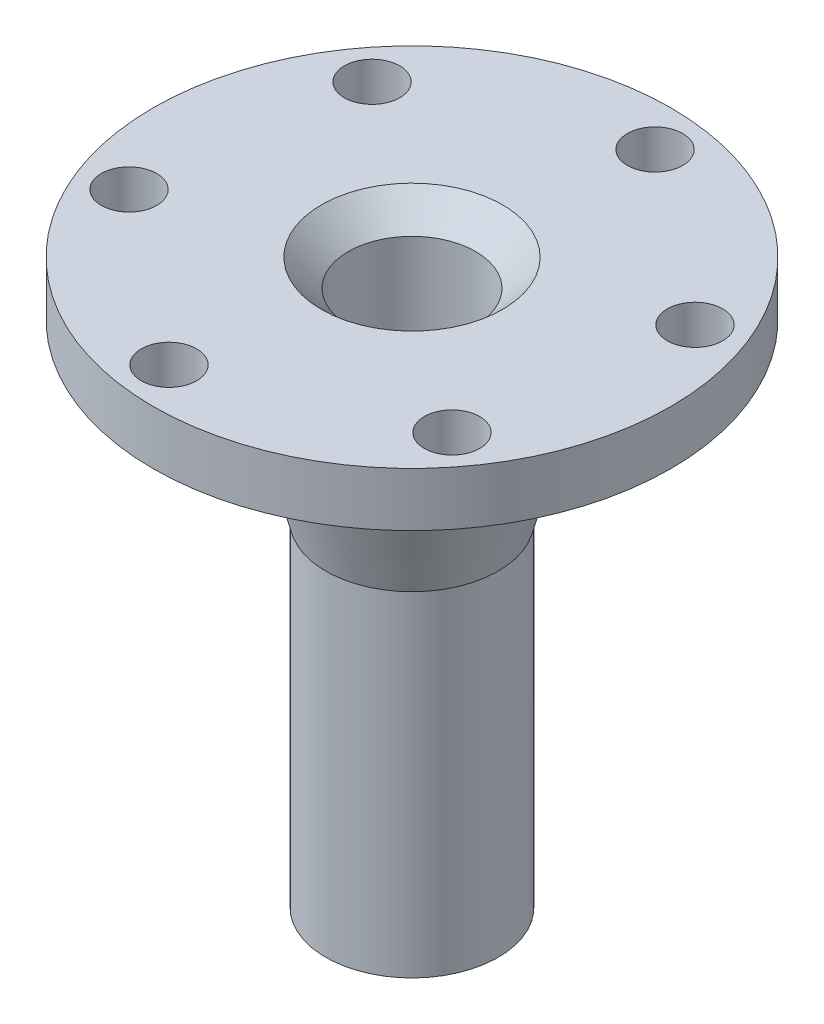
ISO-10303-21;
HEADER;
FILE_DESCRIPTION(('STEP AP214'),'2;1');
FILE_NAME('part.step','',(''),(''),'','','');
FILE_SCHEMA(('AUTOMOTIVE_DESIGN { 1 0 10303 214 1 1 1 1 }'));
ENDSEC;
DATA;
#1=APPLICATION_CONTEXT('core data for automotive mechanical design processes');
#2=APPLICATION_PROTOCOL_DEFINITION('international standard','automotive_design',2000,#1);
#3=PRODUCT_CONTEXT('',#1,'mechanical');
#4=PRODUCT('Part','Part','',(#3));
#5=PRODUCT_RELATED_PRODUCT_CATEGORY('part','',(#4));
#6=PRODUCT_DEFINITION_FORMATION('','',#4);
#7=PRODUCT_DEFINITION_CONTEXT('part definition',#1,'design');
#8=PRODUCT_DEFINITION('design','',#6,#7);
#9=PRODUCT_DEFINITION_SHAPE('','',#8);
#10=(LENGTH_UNIT() NAMED_UNIT(*) SI_UNIT(.MILLI.,.METRE.));
#11=(NAMED_UNIT(*) PLANE_ANGLE_UNIT() SI_UNIT($,.RADIAN.));
#12=(NAMED_UNIT(*) SI_UNIT($,.STERADIAN.) SOLID_ANGLE_UNIT());
#13=UNCERTAINTY_MEASURE_WITH_UNIT(LENGTH_MEASURE(1.E-05),#10,'distance_accuracy_value','');
#14=(GEOMETRIC_REPRESENTATION_CONTEXT(3) GLOBAL_UNCERTAINTY_ASSIGNED_CONTEXT((#13)) GLOBAL_UNIT_ASSIGNED_CONTEXT((#10,
#11,#12)) REPRESENTATION_CONTEXT('',''));
#15=CARTESIAN_POINT('',(0.,0.,0.));
#16=DIRECTION('',(0.,0.,1.));
#17=DIRECTION('',(1.,0.,0.));
#18=AXIS2_PLACEMENT_3D('',#15,#16,#17);
#19=CARTESIAN_POINT('',(0.,30.,0.));
#20=DIRECTION('',(0.,-1.,0.));
#21=DIRECTION('',(0.,0.,-1.));
#22=AXIS2_PLACEMENT_3D('',#19,#20,#21);
#23=CYLINDRICAL_SURFACE('',#22,7.5);
#24=CARTESIAN_POINT('',(0.,3.17500000000006,0.));
#25=DIRECTION('',(0.,1.,0.));
#26=DIRECTION('',(0.,0.,1.));
#27=AXIS2_PLACEMENT_3D('',#24,#25,#26);
#28=CIRCLE('',#27,7.5);
#29=CARTESIAN_POINT('',(0.,3.17500000000006,-7.5));
#30=VERTEX_POINT('',#29);
#31=EDGE_CURVE('E10',#30,#30,#28,.T.);
#32=CARTESIAN_POINT('',(0.,-60.,0.));
#33=DIRECTION('',(0.,-1.,0.));
#34=DIRECTION('',(0.,0.,-1.));
#35=AXIS2_PLACEMENT_3D('',#32,#33,#34);
#36=CIRCLE('',#35,7.5);
#37=CARTESIAN_POINT('',(0.,-60.,-7.5));
#38=VERTEX_POINT('',#37);
#39=EDGE_CURVE('E73',#38,#38,#36,.T.);
#40=CARTESIAN_POINT('',(0.,3.17500000000006,-7.5));
#41=CARTESIAN_POINT('',(0.,2.5169270833334,-7.5));
#42=CARTESIAN_POINT('',(0.,1.85885416666673,-7.5));
#43=CARTESIAN_POINT('',(0.,0.542708333333393,-7.5));
#44=CARTESIAN_POINT('',(0.,-0.115364583333275,-7.5));
#45=CARTESIAN_POINT('',(0.,-1.43151041666661,-7.5));
#46=CARTESIAN_POINT('',(0.,-2.08958333333327,-7.5));
#47=CARTESIAN_POINT('',(0.,-3.4057291666666,-7.5));
#48=CARTESIAN_POINT('',(0.,-4.06380208333327,-7.5));
#49=CARTESIAN_POINT('',(0.,-5.37994791666661,-7.5));
#50=CARTESIAN_POINT('',(0.,-6.03802083333328,-7.5));
#51=CARTESIAN_POINT('',(0.,-7.35416666666661,-7.5));
#52=CARTESIAN_POINT('',(0.,-8.01223958333328,-7.5));
#53=CARTESIAN_POINT('',(0.,-9.32838541666661,-7.5));
#54=CARTESIAN_POINT('',(0.,-9.98645833333328,-7.5));
#55=CARTESIAN_POINT('',(0.,-11.3026041666666,-7.5));
#56=CARTESIAN_POINT('',(0.,-11.9606770833333,-7.5));
#57=CARTESIAN_POINT('',(0.,-13.2768229166666,-7.5));
#58=CARTESIAN_POINT('',(0.,-13.9348958333333,-7.5));
#59=CARTESIAN_POINT('',(0.,-15.2510416666666,-7.5));
#60=CARTESIAN_POINT('',(0.,-15.9091145833333,-7.5));
#61=CARTESIAN_POINT('',(0.,-17.2252604166666,-7.5));
#62=CARTESIAN_POINT('',(0.,-17.8833333333333,-7.5));
#63=CARTESIAN_POINT('',(0.,-19.1994791666666,-7.5));
#64=CARTESIAN_POINT('',(0.,-19.8575520833333,-7.5));
#65=CARTESIAN_POINT('',(0.,-21.1736979166666,-7.5));
#66=CARTESIAN_POINT('',(0.,-21.8317708333333,-7.5));
#67=CARTESIAN_POINT('',(0.,-23.1479166666666,-7.5));
#68=CARTESIAN_POINT('',(0.,-23.8059895833333,-7.5));
#69=CARTESIAN_POINT('',(0.,-25.1221354166666,-7.5));
#70=CARTESIAN_POINT('',(0.,-25.7802083333333,-7.5));
#71=CARTESIAN_POINT('',(0.,-27.0963541666666,-7.5));
#72=CARTESIAN_POINT('',(0.,-27.7544270833333,-7.5));
#73=CARTESIAN_POINT('',(0.,-29.0705729166666,-7.5));
#74=CARTESIAN_POINT('',(0.,-29.7286458333333,-7.5));
#75=CARTESIAN_POINT('',(0.,-31.0447916666666,-7.5));
#76=CARTESIAN_POINT('',(0.,-31.7028645833333,-7.5));
#77=CARTESIAN_POINT('',(0.,-33.0190104166666,-7.5));
#78=CARTESIAN_POINT('',(0.,-33.6770833333333,-7.5));
#79=CARTESIAN_POINT('',(0.,-34.9932291666666,-7.5));
#80=CARTESIAN_POINT('',(0.,-35.6513020833333,-7.5));
#81=CARTESIAN_POINT('',(0.,-36.9674479166666,-7.5));
#82=CARTESIAN_POINT('',(0.,-37.6255208333333,-7.5));
#83=CARTESIAN_POINT('',(0.,-38.9416666666666,-7.5));
#84=CARTESIAN_POINT('',(0.,-39.5997395833333,-7.5));
#85=CARTESIAN_POINT('',(0.,-40.9158854166666,-7.5));
#86=CARTESIAN_POINT('',(0.,-41.5739583333333,-7.5));
#87=CARTESIAN_POINT('',(0.,-42.8901041666666,-7.5));
#88=CARTESIAN_POINT('',(0.,-43.5481770833333,-7.5));
#89=CARTESIAN_POINT('',(0.,-44.8643229166666,-7.5));
#90=CARTESIAN_POINT('',(0.,-45.5223958333333,-7.5));
#91=CARTESIAN_POINT('',(0.,-46.8385416666666,-7.5));
#92=CARTESIAN_POINT('',(0.,-47.4966145833333,-7.5));
#93=CARTESIAN_POINT('',(0.,-48.8127604166666,-7.5));
#94=CARTESIAN_POINT('',(0.,-49.4708333333333,-7.5));
#95=CARTESIAN_POINT('',(0.,-50.7869791666666,-7.5));
#96=CARTESIAN_POINT('',(0.,-51.4450520833333,-7.5));
#97=CARTESIAN_POINT('',(0.,-52.7611979166667,-7.5));
#98=CARTESIAN_POINT('',(0.,-53.4192708333333,-7.5));
#99=CARTESIAN_POINT('',(0.,-54.7354166666667,-7.5));
#100=CARTESIAN_POINT('',(0.,-55.3934895833333,-7.5));
#101=CARTESIAN_POINT('',(0.,-56.7096354166667,-7.5));
#102=CARTESIAN_POINT('',(0.,-57.3677083333333,-7.5));
#103=CARTESIAN_POINT('',(0.,-58.6838541666667,-7.5));
#104=CARTESIAN_POINT('',(0.,-59.3419270833333,-7.5));
#105=CARTESIAN_POINT('',(0.,-60.,-7.5));
#106=B_SPLINE_CURVE_WITH_KNOTS('',3,(#40,#41,#42,#43,#44,#45,#46,#47,#48,#49,#50,#51,#52,#53,
#54,#55,#56,#57,#58,#59,#60,#61,#62,#63,#64,#65,#66,#67,#68,#69,#70,#71,#72,#73,#74,#75,#76,#77,
#78,#79,#80,#81,#82,#83,#84,#85,#86,#87,#88,#89,#90,#91,#92,#93,#94,#95,#96,#97,#98,#99,#100,
#101,#102,#103,#104,#105),.UNSPECIFIED.,.F.,.F.,(4,2,2,2,2,2,2,2,2,2,2,2,2,2,2,2,2,2,2,2,2,2,2,
2,2,2,2,2,2,2,2,2,4),(0.,1.97421875,3.94843750000001,5.92265625,7.896875,9.87109375000001,
11.8453125,13.81953125,15.79375,17.76796875,19.7421875,21.71640625,23.690625,25.66484375,
27.6390625,29.61328125,31.5875,33.56171875,35.5359375,37.51015625,39.484375,41.45859375,
43.4328125,45.40703125,47.38125,49.35546875,51.3296875,53.30390625,55.2781250000001,
57.2523437500001,59.2265625,61.2007812500001,63.1750000000001),.UNSPECIFIED.);
#107=EDGE_CURVE('BSEAM34',#30,#38,#106,.T.);
#108=ORIENTED_EDGE('',*,*,#31,.T.);
#109=ORIENTED_EDGE('',*,*,#39,.T.);
#110=ORIENTED_EDGE('',*,*,#107,.T.);
#111=ORIENTED_EDGE('',*,*,#107,.F.);
#112=EDGE_LOOP('',(#108,#110,#109,#111));
#113=FACE_BOUND('',#112,.T.);
#114=ADVANCED_FACE('F34',(#113),#23,.F.);
#115=CARTESIAN_POINT('',(0.,6.35,-12.7));
#116=DIRECTION('',(0.,1.,0.));
#117=DIRECTION('',(0.,0.,1.));
#118=AXIS2_PLACEMENT_3D('',#115,#116,#117);
#119=PLANE('',#118);
#120=CARTESIAN_POINT('',(0.,6.35,0.));
#121=DIRECTION('',(0.,1.,0.));
#122=DIRECTION('',(0.,0.,1.));
#123=AXIS2_PLACEMENT_3D('',#120,#121,#122);
#124=CIRCLE('',#123,10.6749999999999);
#125=CARTESIAN_POINT('',(0.,6.35,10.6749999999999));
#126=VERTEX_POINT('',#125);
#127=EDGE_CURVE('E41',#126,#126,#124,.F.);
#128=ORIENTED_EDGE('',*,*,#127,.T.);
#129=EDGE_LOOP('',(#128));
#130=FACE_BOUND('',#129,.T.);
#131=CARTESIAN_POINT('',(3.330049479013,6.35,-25.2942370257987));
#132=DIRECTION('',(0.,1.,0.));
#133=DIRECTION('',(0.,0.,1.));
#134=AXIS2_PLACEMENT_3D('',#131,#132,#133);
#135=CIRCLE('',#134,3.2639);
#136=CARTESIAN_POINT('',(3.330049479013,6.35,-22.0303370257987));
#137=VERTEX_POINT('',#136);
#138=EDGE_CURVE('E56',#137,#137,#135,.T.);
#139=ORIENTED_EDGE('',*,*,#138,.F.);
#140=EDGE_LOOP('',(#139));
#141=FACE_BOUND('',#140,.T.);
#142=CARTESIAN_POINT('',(-20.2404270941811,6.35,-15.5310259575841));
#143=DIRECTION('',(0.,1.,0.));
#144=DIRECTION('',(0.,0.,1.));
#145=AXIS2_PLACEMENT_3D('',#142,#143,#144);
#146=CIRCLE('',#145,3.2639);
#147=CARTESIAN_POINT('',(-20.2404270941811,6.35,-12.2671259575841));
#148=VERTEX_POINT('',#147);
#149=EDGE_CURVE('E55',#148,#148,#146,.T.);
#150=ORIENTED_EDGE('',*,*,#149,.F.);
#151=EDGE_LOOP('',(#150));
#152=FACE_BOUND('',#151,.T.);
#153=CARTESIAN_POINT('',(23.5704765731932,6.35,-9.76321106821426));
#154=DIRECTION('',(0.,1.,0.));
#155=DIRECTION('',(0.,0.,1.));
#156=AXIS2_PLACEMENT_3D('',#153,#154,#155);
#157=CIRCLE('',#156,3.2639);
#158=CARTESIAN_POINT('',(23.5704765731932,6.35,-6.49931106821426));
#159=VERTEX_POINT('',#158);
#160=EDGE_CURVE('E92',#159,#159,#157,.T.);
#161=ORIENTED_EDGE('',*,*,#160,.F.);
#162=EDGE_LOOP('',(#161));
#163=FACE_BOUND('',#162,.T.);
#164=CARTESIAN_POINT('',(20.2404270941797,6.35,15.5310259575852));
#165=DIRECTION('',(0.,1.,0.));
#166=DIRECTION('',(0.,0.,1.));
#167=AXIS2_PLACEMENT_3D('',#164,#165,#166);
#168=CIRCLE('',#167,3.2639);
#169=CARTESIAN_POINT('',(20.2404270941797,6.35,18.7949259575852));
#170=VERTEX_POINT('',#169);
#171=EDGE_CURVE('E60',#170,#170,#168,.T.);
#172=ORIENTED_EDGE('',*,*,#171,.F.);
#173=EDGE_LOOP('',(#172));
#174=FACE_BOUND('',#173,.T.);
#175=CARTESIAN_POINT('',(-3.3300494790144,6.35,25.2942370258));
#176=DIRECTION('',(0.,1.,0.));
#177=DIRECTION('',(0.,0.,1.));
#178=AXIS2_PLACEMENT_3D('',#175,#176,#177);
#179=CIRCLE('',#178,3.2639);
#180=CARTESIAN_POINT('',(-3.3300494790144,6.35,28.5581370258));
#181=VERTEX_POINT('',#180);
#182=EDGE_CURVE('E59',#181,#181,#179,.T.);
#183=ORIENTED_EDGE('',*,*,#182,.F.);
#184=EDGE_LOOP('',(#183));
#185=FACE_BOUND('',#184,.T.);
#186=CARTESIAN_POINT('',(-23.5704765731948,6.35,9.76321106821552));
#187=DIRECTION('',(0.,1.,0.));
#188=DIRECTION('',(0.,0.,1.));
#189=AXIS2_PLACEMENT_3D('',#186,#187,#188);
#190=CIRCLE('',#189,3.2639);
#191=CARTESIAN_POINT('',(-23.5704765731948,6.35,13.0271110682155));
#192=VERTEX_POINT('',#191);
#193=EDGE_CURVE('E79',#192,#192,#190,.T.);
#194=ORIENTED_EDGE('',*,*,#193,.F.);
#195=EDGE_LOOP('',(#194));
#196=FACE_BOUND('',#195,.T.);
#197=CARTESIAN_POINT('',(0.,6.35,0.));
#198=DIRECTION('',(0.,-1.,0.));
#199=DIRECTION('',(0.,0.,-1.));
#200=AXIS2_PLACEMENT_3D('',#197,#198,#199);
#201=CIRCLE('',#200,30.48);
#202=CARTESIAN_POINT('',(0.,6.35,-30.48));
#203=VERTEX_POINT('',#202);
#204=EDGE_CURVE('E45',#203,#203,#201,.T.);
#205=ORIENTED_EDGE('',*,*,#204,.F.);
#206=EDGE_LOOP('',(#205));
#207=FACE_BOUND('',#206,.T.);
#208=ADVANCED_FACE('F105',(#130,#141,#152,#163,#174,#185,#196,#207),#119,.T.);
#209=CARTESIAN_POINT('',(0.,0.,0.));
#210=DIRECTION('',(0.,-1.,0.));
#211=DIRECTION('',(0.,0.,-1.));
#212=AXIS2_PLACEMENT_3D('',#209,#210,#211);
#213=CYLINDRICAL_SURFACE('',#212,30.48);
#214=ORIENTED_EDGE('',*,*,#204,.T.);
#215=EDGE_LOOP('',(#214));
#216=FACE_BOUND('',#215,.T.);
#217=CARTESIAN_POINT('',(0.,0.,0.));
#218=DIRECTION('',(0.,-1.,0.));
#219=DIRECTION('',(0.,0.,-1.));
#220=AXIS2_PLACEMENT_3D('',#217,#218,#219);
#221=CIRCLE('',#220,30.48);
#222=CARTESIAN_POINT('',(0.,0.,-30.48));
#223=VERTEX_POINT('',#222);
#224=EDGE_CURVE('E49',#223,#223,#221,.T.);
#225=ORIENTED_EDGE('',*,*,#224,.F.);
#226=EDGE_LOOP('',(#225));
#227=FACE_BOUND('',#226,.T.);
#228=ADVANCED_FACE('F108',(#216,#227),#213,.T.);
#229=CARTESIAN_POINT('',(0.,0.,-30.48));
#230=DIRECTION('',(0.,-1.,0.));
#231=DIRECTION('',(0.,0.,-1.));
#232=AXIS2_PLACEMENT_3D('',#229,#230,#231);
#233=PLANE('',#232);
#234=CARTESIAN_POINT('',(3.330049479013,0.,-25.2942370257987));
#235=DIRECTION('',(0.,-1.,0.));
#236=DIRECTION('',(0.,0.,-1.));
#237=AXIS2_PLACEMENT_3D('',#234,#235,#236);
#238=CIRCLE('',#237,3.2639);
#239=CARTESIAN_POINT('',(3.330049479013,0.,-28.5581370257987));
#240=VERTEX_POINT('',#239);
#241=EDGE_CURVE('E52',#240,#240,#238,.T.);
#242=ORIENTED_EDGE('',*,*,#241,.F.);
#243=EDGE_LOOP('',(#242));
#244=FACE_BOUND('',#243,.T.);
#245=CARTESIAN_POINT('',(-20.2404270941811,0.,-15.5310259575841));
#246=DIRECTION('',(0.,-1.,0.));
#247=DIRECTION('',(0.,0.,-1.));
#248=AXIS2_PLACEMENT_3D('',#245,#246,#247);
#249=CIRCLE('',#248,3.2639);
#250=CARTESIAN_POINT('',(-20.2404270941811,0.,-18.7949259575841));
#251=VERTEX_POINT('',#250);
#252=EDGE_CURVE('E95',#251,#251,#249,.T.);
#253=ORIENTED_EDGE('',*,*,#252,.F.);
#254=EDGE_LOOP('',(#253));
#255=FACE_BOUND('',#254,.T.);
#256=CARTESIAN_POINT('',(23.5704765731932,0.,-9.76321106821426));
#257=DIRECTION('',(0.,-1.,0.));
#258=DIRECTION('',(0.,0.,-1.));
#259=AXIS2_PLACEMENT_3D('',#256,#257,#258);
#260=CIRCLE('',#259,3.2639);
#261=CARTESIAN_POINT('',(23.5704765731932,0.,-13.0271110682143));
#262=VERTEX_POINT('',#261);
#263=EDGE_CURVE('E89',#262,#262,#260,.T.);
#264=ORIENTED_EDGE('',*,*,#263,.F.);
#265=EDGE_LOOP('',(#264));
#266=FACE_BOUND('',#265,.T.);
#267=CARTESIAN_POINT('',(20.2404270941797,0.,15.5310259575852));
#268=DIRECTION('',(0.,-1.,0.));
#269=DIRECTION('',(0.,0.,-1.));
#270=AXIS2_PLACEMENT_3D('',#267,#268,#269);
#271=CIRCLE('',#270,3.2639);
#272=CARTESIAN_POINT('',(20.2404270941797,0.,12.2671259575852));
#273=VERTEX_POINT('',#272);
#274=EDGE_CURVE('E57',#273,#273,#271,.T.);
#275=ORIENTED_EDGE('',*,*,#274,.F.);
#276=EDGE_LOOP('',(#275));
#277=FACE_BOUND('',#276,.T.);
#278=CARTESIAN_POINT('',(-3.3300494790144,0.,25.2942370258));
#279=DIRECTION('',(0.,-1.,0.));
#280=DIRECTION('',(0.,0.,-1.));
#281=AXIS2_PLACEMENT_3D('',#278,#279,#280);
#282=CIRCLE('',#281,3.2639);
#283=CARTESIAN_POINT('',(-3.3300494790144,0.,22.0303370258));
#284=VERTEX_POINT('',#283);
#285=EDGE_CURVE('E82',#284,#284,#282,.T.);
#286=ORIENTED_EDGE('',*,*,#285,.F.);
#287=EDGE_LOOP('',(#286));
#288=FACE_BOUND('',#287,.T.);
#289=CARTESIAN_POINT('',(-23.5704765731948,0.,9.76321106821552));
#290=DIRECTION('',(0.,-1.,0.));
#291=DIRECTION('',(0.,0.,-1.));
#292=AXIS2_PLACEMENT_3D('',#289,#290,#291);
#293=CIRCLE('',#292,3.2639);
#294=CARTESIAN_POINT('',(-23.5704765731948,0.,6.49931106821552));
#295=VERTEX_POINT('',#294);
#296=EDGE_CURVE('E76',#295,#295,#293,.T.);
#297=ORIENTED_EDGE('',*,*,#296,.F.);
#298=EDGE_LOOP('',(#297));
#299=FACE_BOUND('',#298,.T.);
#300=ORIENTED_EDGE('',*,*,#224,.T.);
#301=EDGE_LOOP('',(#300));
#302=FACE_BOUND('',#301,.T.);
#303=CARTESIAN_POINT('',(0.,0.,0.));
#304=DIRECTION('',(0.,-1.,0.));
#305=DIRECTION('',(0.,0.,-1.));
#306=AXIS2_PLACEMENT_3D('',#303,#304,#305);
#307=CIRCLE('',#306,15.68);
#308=CARTESIAN_POINT('',(0.,0.,-15.68));
#309=VERTEX_POINT('',#308);
#310=EDGE_CURVE('E64',#309,#309,#307,.T.);
#311=ORIENTED_EDGE('',*,*,#310,.F.);
#312=EDGE_LOOP('',(#311));
#313=FACE_BOUND('',#312,.T.);
#314=ADVANCED_FACE('F123',(#244,#255,#266,#277,#288,#299,#302,#313),#233,.T.);
#315=CARTESIAN_POINT('',(0.,-20.6009204577807,0.));
#316=DIRECTION('',(0.,1.,0.));
#317=DIRECTION('',(0.,0.,1.));
#318=AXIS2_PLACEMENT_3D('',#315,#316,#317);
#319=CONICAL_SURFACE('',#318,10.16,0.261799387799143);
#320=ORIENTED_EDGE('',*,*,#310,.T.);
#321=EDGE_LOOP('',(#320));
#322=FACE_BOUND('',#321,.T.);
#323=CARTESIAN_POINT('',(0.,-20.6009204577807,0.));
#324=DIRECTION('',(0.,-1.,0.));
#325=DIRECTION('',(0.,0.,-1.));
#326=AXIS2_PLACEMENT_3D('',#323,#324,#325);
#327=CIRCLE('',#326,10.16);
#328=CARTESIAN_POINT('',(0.,-20.6009204577807,-10.16));
#329=VERTEX_POINT('',#328);
#330=EDGE_CURVE('E67',#329,#329,#327,.T.);
#331=ORIENTED_EDGE('',*,*,#330,.F.);
#332=EDGE_LOOP('',(#331));
#333=FACE_BOUND('',#332,.T.);
#334=ADVANCED_FACE('F129',(#322,#333),#319,.T.);
#335=CARTESIAN_POINT('',(0.,0.,0.));
#336=DIRECTION('',(0.,-1.,0.));
#337=DIRECTION('',(0.,0.,-1.));
#338=AXIS2_PLACEMENT_3D('',#335,#336,#337);
#339=CYLINDRICAL_SURFACE('',#338,10.16);
#340=ORIENTED_EDGE('',*,*,#330,.T.);
#341=EDGE_LOOP('',(#340));
#342=FACE_BOUND('',#341,.T.);
#343=CARTESIAN_POINT('',(0.,-60.,0.));
#344=DIRECTION('',(0.,-1.,0.));
#345=DIRECTION('',(0.,0.,-1.));
#346=AXIS2_PLACEMENT_3D('',#343,#344,#345);
#347=CIRCLE('',#346,10.16);
#348=CARTESIAN_POINT('',(0.,-60.,-10.16));
#349=VERTEX_POINT('',#348);
#350=EDGE_CURVE('E70',#349,#349,#347,.T.);
#351=ORIENTED_EDGE('',*,*,#350,.F.);
#352=EDGE_LOOP('',(#351));
#353=FACE_BOUND('',#352,.T.);
#354=ADVANCED_FACE('F136',(#342,#353),#339,.T.);
#355=CARTESIAN_POINT('',(0.,-60.,-10.16));
#356=DIRECTION('',(0.,-1.,0.));
#357=DIRECTION('',(0.,0.,-1.));
#358=AXIS2_PLACEMENT_3D('',#355,#356,#357);
#359=PLANE('',#358);
#360=ORIENTED_EDGE('',*,*,#39,.F.);
#361=EDGE_LOOP('',(#360));
#362=FACE_BOUND('',#361,.T.);
#363=ORIENTED_EDGE('',*,*,#350,.T.);
#364=EDGE_LOOP('',(#363));
#365=FACE_BOUND('',#364,.T.);
#366=ADVANCED_FACE('F142',(#362,#365),#359,.T.);
#367=CARTESIAN_POINT('',(-23.5704765731948,6.35,9.76321106821552));
#368=DIRECTION('',(0.,1.,0.));
#369=DIRECTION('',(0.,0.,1.));
#370=AXIS2_PLACEMENT_3D('',#367,#368,#369);
#371=CYLINDRICAL_SURFACE('',#370,3.2639);
#372=ORIENTED_EDGE('',*,*,#296,.T.);
#373=EDGE_LOOP('',(#372));
#374=FACE_BOUND('',#373,.T.);
#375=ORIENTED_EDGE('',*,*,#193,.T.);
#376=EDGE_LOOP('',(#375));
#377=FACE_BOUND('',#376,.T.);
#378=ADVANCED_FACE('F147',(#374,#377),#371,.F.);
#379=CARTESIAN_POINT('',(-3.3300494790144,6.35,25.2942370258));
#380=DIRECTION('',(0.,1.,0.));
#381=DIRECTION('',(0.,0.,1.));
#382=AXIS2_PLACEMENT_3D('',#379,#380,#381);
#383=CYLINDRICAL_SURFACE('',#382,3.2639);
#384=ORIENTED_EDGE('',*,*,#285,.T.);
#385=EDGE_LOOP('',(#384));
#386=FACE_BOUND('',#385,.T.);
#387=ORIENTED_EDGE('',*,*,#182,.T.);
#388=EDGE_LOOP('',(#387));
#389=FACE_BOUND('',#388,.T.);
#390=ADVANCED_FACE('F153',(#386,#389),#383,.F.);
#391=CARTESIAN_POINT('',(20.2404270941797,6.35,15.5310259575852));
#392=DIRECTION('',(0.,1.,0.));
#393=DIRECTION('',(0.,0.,1.));
#394=AXIS2_PLACEMENT_3D('',#391,#392,#393);
#395=CYLINDRICAL_SURFACE('',#394,3.2639);
#396=ORIENTED_EDGE('',*,*,#274,.T.);
#397=EDGE_LOOP('',(#396));
#398=FACE_BOUND('',#397,.T.);
#399=ORIENTED_EDGE('',*,*,#171,.T.);
#400=EDGE_LOOP('',(#399));
#401=FACE_BOUND('',#400,.T.);
#402=ADVANCED_FACE('F166',(#398,#401),#395,.F.);
#403=CARTESIAN_POINT('',(23.5704765731932,6.35,-9.76321106821426));
#404=DIRECTION('',(0.,1.,0.));
#405=DIRECTION('',(0.,0.,1.));
#406=AXIS2_PLACEMENT_3D('',#403,#404,#405);
#407=CYLINDRICAL_SURFACE('',#406,3.2639);
#408=ORIENTED_EDGE('',*,*,#263,.T.);
#409=EDGE_LOOP('',(#408));
#410=FACE_BOUND('',#409,.T.);
#411=ORIENTED_EDGE('',*,*,#160,.T.);
#412=EDGE_LOOP('',(#411));
#413=FACE_BOUND('',#412,.T.);
#414=ADVANCED_FACE('F170',(#410,#413),#407,.F.);
#415=CARTESIAN_POINT('',(-20.2404270941811,6.35,-15.5310259575841));
#416=DIRECTION('',(0.,1.,0.));
#417=DIRECTION('',(0.,0.,1.));
#418=AXIS2_PLACEMENT_3D('',#415,#416,#417);
#419=CYLINDRICAL_SURFACE('',#418,3.2639);
#420=ORIENTED_EDGE('',*,*,#252,.T.);
#421=EDGE_LOOP('',(#420));
#422=FACE_BOUND('',#421,.T.);
#423=ORIENTED_EDGE('',*,*,#149,.T.);
#424=EDGE_LOOP('',(#423));
#425=FACE_BOUND('',#424,.T.);
#426=ADVANCED_FACE('F174',(#422,#425),#419,.F.);
#427=CARTESIAN_POINT('',(3.330049479013,6.35,-25.2942370257987));
#428=DIRECTION('',(0.,1.,0.));
#429=DIRECTION('',(0.,0.,1.));
#430=AXIS2_PLACEMENT_3D('',#427,#428,#429);
#431=CYLINDRICAL_SURFACE('',#430,3.2639);
#432=ORIENTED_EDGE('',*,*,#241,.T.);
#433=EDGE_LOOP('',(#432));
#434=FACE_BOUND('',#433,.T.);
#435=ORIENTED_EDGE('',*,*,#138,.T.);
#436=EDGE_LOOP('',(#435));
#437=FACE_BOUND('',#436,.T.);
#438=ADVANCED_FACE('F103',(#434,#437),#431,.F.);
#439=CARTESIAN_POINT('',(0.,6.35,0.));
#440=DIRECTION('',(0.,1.,0.));
#441=DIRECTION('',(0.,0.,1.));
#442=AXIS2_PLACEMENT_3D('',#439,#440,#441);
#443=CONICAL_SURFACE('',#442,10.6749999999999,0.785398163397448);
#444=ORIENTED_EDGE('',*,*,#31,.F.);
#445=EDGE_LOOP('',(#444));
#446=FACE_BOUND('',#445,.T.);
#447=ORIENTED_EDGE('',*,*,#127,.F.);
#448=EDGE_LOOP('',(#447));
#449=FACE_BOUND('',#448,.T.);
#450=ADVANCED_FACE('F36',(#446,#449),#443,.F.);
#451=CLOSED_SHELL('',(#114,#208,#228,#314,#334,#354,#366,#378,#390,#402,#414,#426,#438,#450));
#452=MANIFOLD_SOLID_BREP('B2',#451);
#453=ADVANCED_BREP_SHAPE_REPRESENTATION('',(#18,#452),#14);
#454=SHAPE_DEFINITION_REPRESENTATION(#9,#453);
ENDSEC;
END-ISO-10303-21;
